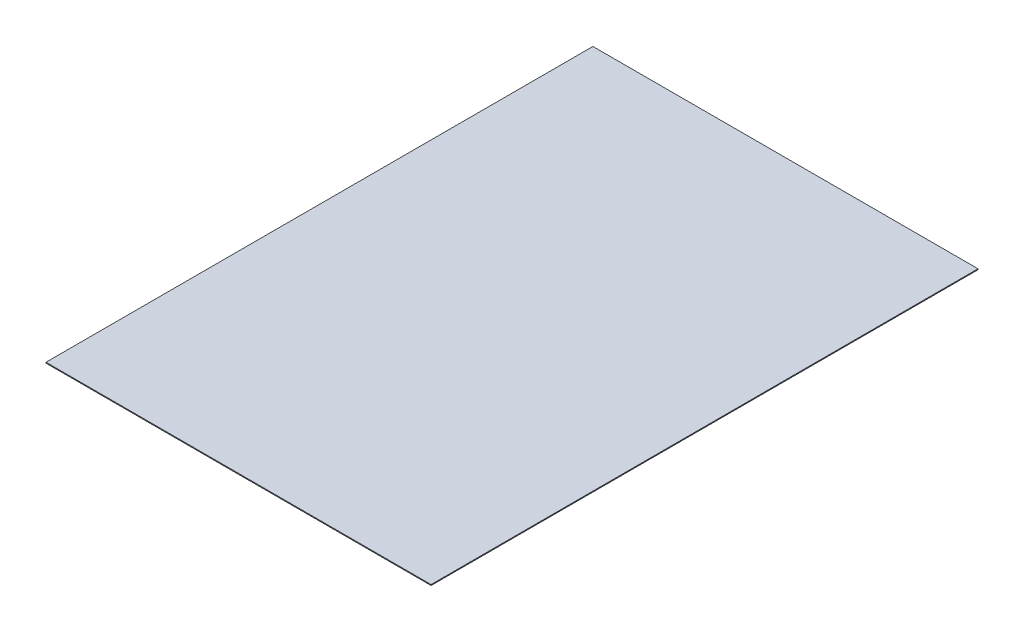
ISO-10303-21;
HEADER;
FILE_DESCRIPTION(('STEP AP214'),'2;1');
FILE_NAME('part.step','',(''),(''),'','','');
FILE_SCHEMA(('AUTOMOTIVE_DESIGN { 1 0 10303 214 1 1 1 1 }'));
ENDSEC;
DATA;
#1=APPLICATION_CONTEXT('core data for automotive mechanical design processes');
#2=APPLICATION_PROTOCOL_DEFINITION('international standard','automotive_design',2000,#1);
#3=PRODUCT_CONTEXT('',#1,'mechanical');
#4=PRODUCT('Part','Part','',(#3));
#5=PRODUCT_RELATED_PRODUCT_CATEGORY('part','',(#4));
#6=PRODUCT_DEFINITION_FORMATION('','',#4);
#7=PRODUCT_DEFINITION_CONTEXT('part definition',#1,'design');
#8=PRODUCT_DEFINITION('design','',#6,#7);
#9=PRODUCT_DEFINITION_SHAPE('','',#8);
#10=(LENGTH_UNIT() NAMED_UNIT(*) SI_UNIT(.MILLI.,.METRE.));
#11=(NAMED_UNIT(*) PLANE_ANGLE_UNIT() SI_UNIT($,.RADIAN.));
#12=(NAMED_UNIT(*) SI_UNIT($,.STERADIAN.) SOLID_ANGLE_UNIT());
#13=UNCERTAINTY_MEASURE_WITH_UNIT(LENGTH_MEASURE(1.E-05),#10,'distance_accuracy_value','');
#14=(GEOMETRIC_REPRESENTATION_CONTEXT(3) GLOBAL_UNCERTAINTY_ASSIGNED_CONTEXT((#13)) GLOBAL_UNIT_ASSIGNED_CONTEXT((#10,
#11,#12)) REPRESENTATION_CONTEXT('',''));
#15=CARTESIAN_POINT('',(0.,0.,0.));
#16=DIRECTION('',(0.,0.,1.));
#17=DIRECTION('',(1.,0.,0.));
#18=AXIS2_PLACEMENT_3D('',#15,#16,#17);
#19=CARTESIAN_POINT('',(0.,3.175,2000.));
#20=DIRECTION('',(0.,0.,-1.));
#21=DIRECTION('',(-1.,0.,0.));
#22=AXIS2_PLACEMENT_3D('',#19,#20,#21);
#23=PLANE('',#22);
#24=DIRECTION('',(1.,0.,0.));
#25=VECTOR('',#24,1.);
#26=CARTESIAN_POINT('',(0.,3.175,2000.));
#27=LINE('',#26,#25);
#28=CARTESIAN_POINT('',(591.824229308746,3.175,2000.));
#29=VERTEX_POINT('',#28);
#30=CARTESIAN_POINT('',(2000.,3.175,2000.));
#31=VERTEX_POINT('',#30);
#32=EDGE_CURVE('E88',#29,#31,#27,.T.);
#33=ORIENTED_EDGE('',*,*,#32,.F.);
#34=DIRECTION('',(0.,1.,0.));
#35=VECTOR('',#34,1.);
#36=CARTESIAN_POINT('',(591.824229308746,0.,2000.));
#37=LINE('',#36,#35);
#38=CARTESIAN_POINT('',(591.824229308746,0.,2000.));
#39=VERTEX_POINT('',#38);
#40=EDGE_CURVE('E95',#39,#29,#37,.T.);
#41=ORIENTED_EDGE('',*,*,#40,.F.);
#42=DIRECTION('',(1.,0.,0.));
#43=VECTOR('',#42,1.);
#44=CARTESIAN_POINT('',(0.,0.,2000.));
#45=LINE('',#44,#43);
#46=CARTESIAN_POINT('',(2000.,0.,2000.));
#47=VERTEX_POINT('',#46);
#48=EDGE_CURVE('E80',#39,#47,#45,.T.);
#49=ORIENTED_EDGE('',*,*,#48,.T.);
#50=DIRECTION('',(0.,-1.,0.));
#51=VECTOR('',#50,1.);
#52=CARTESIAN_POINT('',(2000.,3.175,2000.));
#53=LINE('',#52,#51);
#54=EDGE_CURVE('E11',#31,#47,#53,.T.);
#55=ORIENTED_EDGE('',*,*,#54,.F.);
#56=EDGE_LOOP('',(#33,#41,#49,#55));
#57=FACE_BOUND('',#56,.T.);
#58=ADVANCED_FACE('F36',(#57),#23,.F.);
#59=CARTESIAN_POINT('',(2000.,3.175,0.));
#60=DIRECTION('',(-1.,0.,0.));
#61=DIRECTION('',(0.,0.,1.));
#62=AXIS2_PLACEMENT_3D('',#59,#60,#61);
#63=PLANE('',#62);
#64=DIRECTION('',(0.,0.,-1.));
#65=VECTOR('',#64,1.);
#66=CARTESIAN_POINT('',(2000.,0.,0.));
#67=LINE('',#66,#65);
#68=CARTESIAN_POINT('',(2000.,0.,0.));
#69=VERTEX_POINT('',#68);
#70=EDGE_CURVE('E71',#47,#69,#67,.T.);
#71=ORIENTED_EDGE('',*,*,#70,.T.);
#72=DIRECTION('',(0.,-1.,0.));
#73=VECTOR('',#72,1.);
#74=CARTESIAN_POINT('',(2000.,3.175,0.));
#75=LINE('',#74,#73);
#76=CARTESIAN_POINT('',(2000.,3.175,0.));
#77=VERTEX_POINT('',#76);
#78=EDGE_CURVE('E43',#77,#69,#75,.T.);
#79=ORIENTED_EDGE('',*,*,#78,.F.);
#80=DIRECTION('',(0.,0.,-1.));
#81=VECTOR('',#80,1.);
#82=CARTESIAN_POINT('',(2000.,3.175,0.));
#83=LINE('',#82,#81);
#84=EDGE_CURVE('E59',#31,#77,#83,.T.);
#85=ORIENTED_EDGE('',*,*,#84,.F.);
#86=ORIENTED_EDGE('',*,*,#54,.T.);
#87=EDGE_LOOP('',(#71,#79,#85,#86));
#88=FACE_BOUND('',#87,.T.);
#89=ADVANCED_FACE('F73',(#88),#63,.F.);
#90=CARTESIAN_POINT('',(0.,3.175,0.));
#91=DIRECTION('',(0.,0.,1.));
#92=DIRECTION('',(1.,0.,0.));
#93=AXIS2_PLACEMENT_3D('',#90,#91,#92);
#94=PLANE('',#93);
#95=DIRECTION('',(-1.,0.,0.));
#96=VECTOR('',#95,1.);
#97=CARTESIAN_POINT('',(0.,0.,0.));
#98=LINE('',#97,#96);
#99=CARTESIAN_POINT('',(591.824229308746,0.,0.));
#100=VERTEX_POINT('',#99);
#101=EDGE_CURVE('E79',#69,#100,#98,.T.);
#102=ORIENTED_EDGE('',*,*,#101,.T.);
#103=DIRECTION('',(0.,1.,0.));
#104=VECTOR('',#103,1.);
#105=CARTESIAN_POINT('',(591.824229308746,0.,0.));
#106=LINE('',#105,#104);
#107=CARTESIAN_POINT('',(591.824229308746,3.175,0.));
#108=VERTEX_POINT('',#107);
#109=EDGE_CURVE('E50',#100,#108,#106,.T.);
#110=ORIENTED_EDGE('',*,*,#109,.T.);
#111=DIRECTION('',(-1.,0.,0.));
#112=VECTOR('',#111,1.);
#113=CARTESIAN_POINT('',(0.,3.175,0.));
#114=LINE('',#113,#112);
#115=EDGE_CURVE('E85',#77,#108,#114,.T.);
#116=ORIENTED_EDGE('',*,*,#115,.F.);
#117=ORIENTED_EDGE('',*,*,#78,.T.);
#118=EDGE_LOOP('',(#102,#110,#116,#117));
#119=FACE_BOUND('',#118,.T.);
#120=ADVANCED_FACE('F84',(#119),#94,.F.);
#121=CARTESIAN_POINT('',(0.,3.175,0.));
#122=DIRECTION('',(0.,1.,0.));
#123=DIRECTION('',(0.,0.,1.));
#124=AXIS2_PLACEMENT_3D('',#121,#122,#123);
#125=PLANE('',#124);
#126=DIRECTION('',(0.,0.,-1.));
#127=VECTOR('',#126,1.);
#128=CARTESIAN_POINT('',(591.824229308746,3.175,0.));
#129=LINE('',#128,#127);
#130=EDGE_CURVE('E99',#29,#108,#129,.T.);
#131=ORIENTED_EDGE('',*,*,#130,.F.);
#132=ORIENTED_EDGE('',*,*,#32,.T.);
#133=ORIENTED_EDGE('',*,*,#84,.T.);
#134=ORIENTED_EDGE('',*,*,#115,.T.);
#135=EDGE_LOOP('',(#131,#132,#133,#134));
#136=FACE_BOUND('',#135,.T.);
#137=ADVANCED_FACE('F107',(#136),#125,.T.);
#138=CARTESIAN_POINT('',(0.,0.,0.));
#139=DIRECTION('',(0.,1.,0.));
#140=DIRECTION('',(0.,0.,1.));
#141=AXIS2_PLACEMENT_3D('',#138,#139,#140);
#142=PLANE('',#141);
#143=ORIENTED_EDGE('',*,*,#48,.F.);
#144=DIRECTION('',(0.,0.,-1.));
#145=VECTOR('',#144,1.);
#146=CARTESIAN_POINT('',(591.824229308746,0.,0.));
#147=LINE('',#146,#145);
#148=EDGE_CURVE('E87',#39,#100,#147,.T.);
#149=ORIENTED_EDGE('',*,*,#148,.T.);
#150=ORIENTED_EDGE('',*,*,#101,.F.);
#151=ORIENTED_EDGE('',*,*,#70,.F.);
#152=EDGE_LOOP('',(#143,#149,#150,#151));
#153=FACE_BOUND('',#152,.T.);
#154=ADVANCED_FACE('F86',(#153),#142,.F.);
#155=CARTESIAN_POINT('',(591.824229308746,0.,0.));
#156=DIRECTION('',(1.,0.,0.));
#157=DIRECTION('',(0.,0.,-1.));
#158=AXIS2_PLACEMENT_3D('',#155,#156,#157);
#159=PLANE('',#158);
#160=ORIENTED_EDGE('',*,*,#130,.T.);
#161=ORIENTED_EDGE('',*,*,#109,.F.);
#162=ORIENTED_EDGE('',*,*,#148,.F.);
#163=ORIENTED_EDGE('',*,*,#40,.T.);
#164=EDGE_LOOP('',(#160,#161,#162,#163));
#165=FACE_BOUND('',#164,.T.);
#166=ADVANCED_FACE('F103',(#165),#159,.F.);
#167=CLOSED_SHELL('',(#58,#89,#120,#137,#154,#166));
#168=MANIFOLD_SOLID_BREP('B2',#167);
#169=ADVANCED_BREP_SHAPE_REPRESENTATION('',(#18,#168),#14);
#170=SHAPE_DEFINITION_REPRESENTATION(#9,#169);
ENDSEC;
END-ISO-10303-21;
